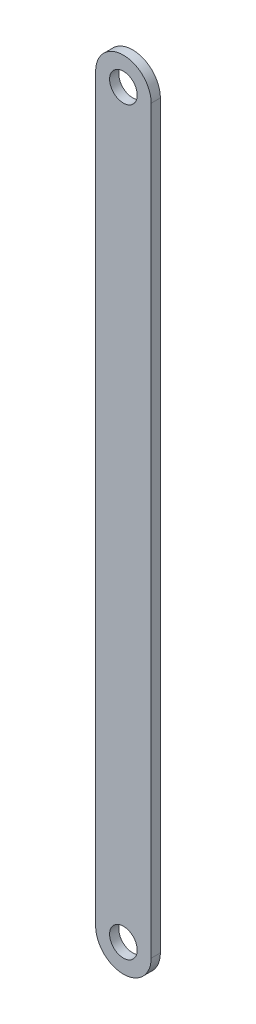
ISO-10303-21;
HEADER;
FILE_DESCRIPTION(('STEP AP214'),'2;1');
FILE_NAME('part.step','',(''),(''),'','','');
FILE_SCHEMA(('AUTOMOTIVE_DESIGN { 1 0 10303 214 1 1 1 1 }'));
ENDSEC;
DATA;
#1=APPLICATION_CONTEXT('core data for automotive mechanical design processes');
#2=APPLICATION_PROTOCOL_DEFINITION('international standard','automotive_design',2000,#1);
#3=PRODUCT_CONTEXT('',#1,'mechanical');
#4=PRODUCT('Part','Part','',(#3));
#5=PRODUCT_RELATED_PRODUCT_CATEGORY('part','',(#4));
#6=PRODUCT_DEFINITION_FORMATION('','',#4);
#7=PRODUCT_DEFINITION_CONTEXT('part definition',#1,'design');
#8=PRODUCT_DEFINITION('design','',#6,#7);
#9=PRODUCT_DEFINITION_SHAPE('','',#8);
#10=(LENGTH_UNIT() NAMED_UNIT(*) SI_UNIT(.MILLI.,.METRE.));
#11=(NAMED_UNIT(*) PLANE_ANGLE_UNIT() SI_UNIT($,.RADIAN.));
#12=(NAMED_UNIT(*) SI_UNIT($,.STERADIAN.) SOLID_ANGLE_UNIT());
#13=UNCERTAINTY_MEASURE_WITH_UNIT(LENGTH_MEASURE(1.E-05),#10,'distance_accuracy_value','');
#14=(GEOMETRIC_REPRESENTATION_CONTEXT(3) GLOBAL_UNCERTAINTY_ASSIGNED_CONTEXT((#13)) GLOBAL_UNIT_ASSIGNED_CONTEXT((#10,
#11,#12)) REPRESENTATION_CONTEXT('',''));
#15=CARTESIAN_POINT('',(0.,0.,0.));
#16=DIRECTION('',(0.,0.,1.));
#17=DIRECTION('',(1.,0.,0.));
#18=AXIS2_PLACEMENT_3D('',#15,#16,#17);
#19=CARTESIAN_POINT('',(0.,-161.,2.));
#20=DIRECTION('',(0.,0.,-1.));
#21=DIRECTION('',(-1.,0.,0.));
#22=AXIS2_PLACEMENT_3D('',#19,#20,#21);
#23=PLANE('',#22);
#24=CARTESIAN_POINT('',(0.,-161.,2.));
#25=DIRECTION('',(0.,0.,1.));
#26=DIRECTION('',(-1.,0.,0.));
#27=AXIS2_PLACEMENT_3D('',#24,#25,#26);
#28=CIRCLE('',#27,6.03863554664991);
#29=CARTESIAN_POINT('',(-6.03863554664983,-161.,2.));
#30=VERTEX_POINT('',#29);
#31=CARTESIAN_POINT('',(6.03863554664999,-161.,2.));
#32=VERTEX_POINT('',#31);
#33=EDGE_CURVE('E85',#30,#32,#28,.T.);
#34=ORIENTED_EDGE('',*,*,#33,.T.);
#35=DIRECTION('',(0.,1.,0.));
#36=VECTOR('',#35,1.);
#37=CARTESIAN_POINT('',(6.03863554664985,0.,2.));
#38=LINE('',#37,#36);
#39=CARTESIAN_POINT('',(6.03863554664985,0.,2.));
#40=VERTEX_POINT('',#39);
#41=EDGE_CURVE('E80',#32,#40,#38,.T.);
#42=ORIENTED_EDGE('',*,*,#41,.T.);
#43=CARTESIAN_POINT('',(0.,0.,2.));
#44=DIRECTION('',(0.,0.,1.));
#45=DIRECTION('',(1.,0.,0.));
#46=AXIS2_PLACEMENT_3D('',#43,#44,#45);
#47=CIRCLE('',#46,6.03863554664984);
#48=CARTESIAN_POINT('',(-6.03863554664984,0.,2.));
#49=VERTEX_POINT('',#48);
#50=EDGE_CURVE('E83',#40,#49,#47,.T.);
#51=ORIENTED_EDGE('',*,*,#50,.T.);
#52=DIRECTION('',(0.,-1.,0.));
#53=VECTOR('',#52,1.);
#54=CARTESIAN_POINT('',(-6.03863554664983,-161.,2.));
#55=LINE('',#54,#53);
#56=EDGE_CURVE('E50',#49,#30,#55,.T.);
#57=ORIENTED_EDGE('',*,*,#56,.T.);
#58=EDGE_LOOP('',(#34,#42,#51,#57));
#59=FACE_BOUND('',#58,.T.);
#60=CARTESIAN_POINT('',(0.,0.,2.));
#61=DIRECTION('',(0.,0.,1.));
#62=DIRECTION('',(1.,0.,0.));
#63=AXIS2_PLACEMENT_3D('',#60,#61,#62);
#64=CIRCLE('',#63,3.);
#65=CARTESIAN_POINT('',(3.,0.,2.));
#66=VERTEX_POINT('',#65);
#67=EDGE_CURVE('E100',#66,#66,#64,.T.);
#68=ORIENTED_EDGE('',*,*,#67,.F.);
#69=EDGE_LOOP('',(#68));
#70=FACE_BOUND('',#69,.T.);
#71=CARTESIAN_POINT('',(0.,-161.,2.));
#72=DIRECTION('',(0.,0.,1.));
#73=DIRECTION('',(1.,0.,0.));
#74=AXIS2_PLACEMENT_3D('',#71,#72,#73);
#75=CIRCLE('',#74,3.);
#76=CARTESIAN_POINT('',(3.00000000000002,-161.,2.));
#77=VERTEX_POINT('',#76);
#78=EDGE_CURVE('E115',#77,#77,#75,.T.);
#79=ORIENTED_EDGE('',*,*,#78,.F.);
#80=EDGE_LOOP('',(#79));
#81=FACE_BOUND('',#80,.T.);
#82=ADVANCED_FACE('F33',(#59,#70,#81),#23,.F.);
#83=CARTESIAN_POINT('',(0.,-161.,0.));
#84=DIRECTION('',(0.,0.,-1.));
#85=DIRECTION('',(-1.,0.,0.));
#86=AXIS2_PLACEMENT_3D('',#83,#84,#85);
#87=PLANE('',#86);
#88=CARTESIAN_POINT('',(0.,0.,0.));
#89=DIRECTION('',(0.,0.,1.));
#90=DIRECTION('',(1.,0.,0.));
#91=AXIS2_PLACEMENT_3D('',#88,#89,#90);
#92=CIRCLE('',#91,3.);
#93=CARTESIAN_POINT('',(3.,0.,0.));
#94=VERTEX_POINT('',#93);
#95=EDGE_CURVE('E112',#94,#94,#92,.T.);
#96=ORIENTED_EDGE('',*,*,#95,.T.);
#97=EDGE_LOOP('',(#96));
#98=FACE_BOUND('',#97,.T.);
#99=CARTESIAN_POINT('',(0.,-161.,0.));
#100=DIRECTION('',(0.,0.,1.));
#101=DIRECTION('',(-1.,0.,0.));
#102=AXIS2_PLACEMENT_3D('',#99,#100,#101);
#103=CIRCLE('',#102,6.03863554664991);
#104=CARTESIAN_POINT('',(-6.03863554664983,-161.,0.));
#105=VERTEX_POINT('',#104);
#106=CARTESIAN_POINT('',(6.03863554664999,-161.,0.));
#107=VERTEX_POINT('',#106);
#108=EDGE_CURVE('E97',#105,#107,#103,.T.);
#109=ORIENTED_EDGE('',*,*,#108,.F.);
#110=DIRECTION('',(0.,-1.,0.));
#111=VECTOR('',#110,1.);
#112=CARTESIAN_POINT('',(-6.03863554664983,-161.,0.));
#113=LINE('',#112,#111);
#114=CARTESIAN_POINT('',(-6.03863554664984,0.,0.));
#115=VERTEX_POINT('',#114);
#116=EDGE_CURVE('E73',#115,#105,#113,.T.);
#117=ORIENTED_EDGE('',*,*,#116,.F.);
#118=CARTESIAN_POINT('',(0.,0.,0.));
#119=DIRECTION('',(0.,0.,1.));
#120=DIRECTION('',(1.,0.,0.));
#121=AXIS2_PLACEMENT_3D('',#118,#119,#120);
#122=CIRCLE('',#121,6.03863554664984);
#123=CARTESIAN_POINT('',(6.03863554664985,0.,0.));
#124=VERTEX_POINT('',#123);
#125=EDGE_CURVE('E67',#124,#115,#122,.T.);
#126=ORIENTED_EDGE('',*,*,#125,.F.);
#127=DIRECTION('',(0.,1.,0.));
#128=VECTOR('',#127,1.);
#129=CARTESIAN_POINT('',(6.03863554664985,0.,0.));
#130=LINE('',#129,#128);
#131=EDGE_CURVE('E89',#107,#124,#130,.T.);
#132=ORIENTED_EDGE('',*,*,#131,.F.);
#133=EDGE_LOOP('',(#109,#117,#126,#132));
#134=FACE_BOUND('',#133,.T.);
#135=CARTESIAN_POINT('',(0.,-161.,0.));
#136=DIRECTION('',(0.,0.,1.));
#137=DIRECTION('',(1.,0.,0.));
#138=AXIS2_PLACEMENT_3D('',#135,#136,#137);
#139=CIRCLE('',#138,3.);
#140=CARTESIAN_POINT('',(3.00000000000002,-161.,0.));
#141=VERTEX_POINT('',#140);
#142=EDGE_CURVE('E118',#141,#141,#139,.T.);
#143=ORIENTED_EDGE('',*,*,#142,.T.);
#144=EDGE_LOOP('',(#143));
#145=FACE_BOUND('',#144,.T.);
#146=ADVANCED_FACE('F108',(#98,#134,#145),#87,.T.);
#147=CARTESIAN_POINT('',(0.,-161.,2.));
#148=DIRECTION('',(0.,0.,-1.));
#149=DIRECTION('',(-1.,0.,0.));
#150=AXIS2_PLACEMENT_3D('',#147,#148,#149);
#151=CYLINDRICAL_SURFACE('',#150,6.03863554664991);
#152=ORIENTED_EDGE('',*,*,#108,.T.);
#153=DIRECTION('',(0.,0.,-1.));
#154=VECTOR('',#153,1.);
#155=CARTESIAN_POINT('',(6.03863554664999,-161.,2.));
#156=LINE('',#155,#154);
#157=EDGE_CURVE('E11',#32,#107,#156,.T.);
#158=ORIENTED_EDGE('',*,*,#157,.F.);
#159=ORIENTED_EDGE('',*,*,#33,.F.);
#160=DIRECTION('',(0.,0.,-1.));
#161=VECTOR('',#160,1.);
#162=CARTESIAN_POINT('',(-6.03863554664983,-161.,2.));
#163=LINE('',#162,#161);
#164=EDGE_CURVE('E93',#30,#105,#163,.T.);
#165=ORIENTED_EDGE('',*,*,#164,.T.);
#166=EDGE_LOOP('',(#152,#158,#159,#165));
#167=FACE_BOUND('',#166,.T.);
#168=ADVANCED_FACE('F35',(#167),#151,.T.);
#169=CARTESIAN_POINT('',(6.03863554664985,0.,2.));
#170=DIRECTION('',(-1.,0.,0.));
#171=DIRECTION('',(0.,-1.,0.));
#172=AXIS2_PLACEMENT_3D('',#169,#170,#171);
#173=PLANE('',#172);
#174=ORIENTED_EDGE('',*,*,#131,.T.);
#175=DIRECTION('',(0.,0.,-1.));
#176=VECTOR('',#175,1.);
#177=CARTESIAN_POINT('',(6.03863554664985,0.,2.));
#178=LINE('',#177,#176);
#179=EDGE_CURVE('E42',#40,#124,#178,.T.);
#180=ORIENTED_EDGE('',*,*,#179,.F.);
#181=ORIENTED_EDGE('',*,*,#41,.F.);
#182=ORIENTED_EDGE('',*,*,#157,.T.);
#183=EDGE_LOOP('',(#174,#180,#181,#182));
#184=FACE_BOUND('',#183,.T.);
#185=ADVANCED_FACE('F88',(#184),#173,.F.);
#186=CARTESIAN_POINT('',(0.,0.,2.));
#187=DIRECTION('',(0.,0.,-1.));
#188=DIRECTION('',(-1.,0.,0.));
#189=AXIS2_PLACEMENT_3D('',#186,#187,#188);
#190=CYLINDRICAL_SURFACE('',#189,6.03863554664984);
#191=ORIENTED_EDGE('',*,*,#125,.T.);
#192=DIRECTION('',(0.,0.,-1.));
#193=VECTOR('',#192,1.);
#194=CARTESIAN_POINT('',(-6.03863554664984,0.,2.));
#195=LINE('',#194,#193);
#196=EDGE_CURVE('E90',#49,#115,#195,.T.);
#197=ORIENTED_EDGE('',*,*,#196,.F.);
#198=ORIENTED_EDGE('',*,*,#50,.F.);
#199=ORIENTED_EDGE('',*,*,#179,.T.);
#200=EDGE_LOOP('',(#191,#197,#198,#199));
#201=FACE_BOUND('',#200,.T.);
#202=ADVANCED_FACE('F91',(#201),#190,.T.);
#203=CARTESIAN_POINT('',(-6.03863554664983,-161.,2.));
#204=DIRECTION('',(1.,0.,0.));
#205=DIRECTION('',(0.,1.,0.));
#206=AXIS2_PLACEMENT_3D('',#203,#204,#205);
#207=PLANE('',#206);
#208=ORIENTED_EDGE('',*,*,#116,.T.);
#209=ORIENTED_EDGE('',*,*,#164,.F.);
#210=ORIENTED_EDGE('',*,*,#56,.F.);
#211=ORIENTED_EDGE('',*,*,#196,.T.);
#212=EDGE_LOOP('',(#208,#209,#210,#211));
#213=FACE_BOUND('',#212,.T.);
#214=ADVANCED_FACE('F105',(#213),#207,.F.);
#215=CARTESIAN_POINT('',(0.,0.,2.));
#216=DIRECTION('',(0.,0.,-1.));
#217=DIRECTION('',(-1.,0.,0.));
#218=AXIS2_PLACEMENT_3D('',#215,#216,#217);
#219=CYLINDRICAL_SURFACE('',#218,3.);
#220=ORIENTED_EDGE('',*,*,#67,.T.);
#221=EDGE_LOOP('',(#220));
#222=FACE_BOUND('',#221,.T.);
#223=ORIENTED_EDGE('',*,*,#95,.F.);
#224=EDGE_LOOP('',(#223));
#225=FACE_BOUND('',#224,.T.);
#226=ADVANCED_FACE('F135',(#222,#225),#219,.F.);
#227=CARTESIAN_POINT('',(0.,-161.,2.));
#228=DIRECTION('',(0.,0.,-1.));
#229=DIRECTION('',(-1.,0.,0.));
#230=AXIS2_PLACEMENT_3D('',#227,#228,#229);
#231=CYLINDRICAL_SURFACE('',#230,3.);
#232=ORIENTED_EDGE('',*,*,#78,.T.);
#233=EDGE_LOOP('',(#232));
#234=FACE_BOUND('',#233,.T.);
#235=ORIENTED_EDGE('',*,*,#142,.F.);
#236=EDGE_LOOP('',(#235));
#237=FACE_BOUND('',#236,.T.);
#238=ADVANCED_FACE('F124',(#234,#237),#231,.F.);
#239=CLOSED_SHELL('',(#82,#146,#168,#185,#202,#214,#226,#238));
#240=MANIFOLD_SOLID_BREP('B2',#239);
#241=ADVANCED_BREP_SHAPE_REPRESENTATION('',(#18,#240),#14);
#242=SHAPE_DEFINITION_REPRESENTATION(#9,#241);
ENDSEC;
END-ISO-10303-21;
